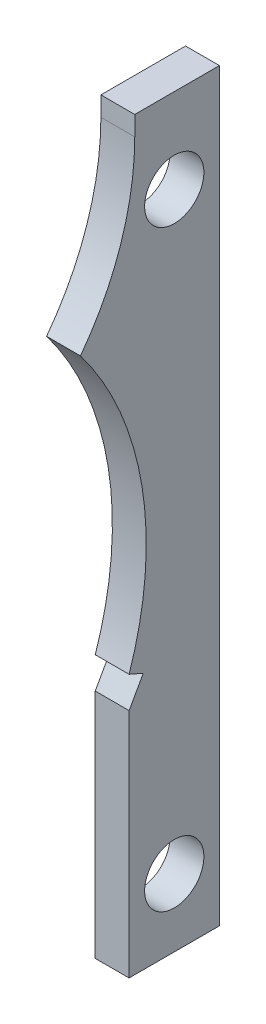
ISO-10303-21;
HEADER;
FILE_DESCRIPTION(('STEP AP214'),'2;1');
FILE_NAME('part.step','',(''),(''),'','','');
FILE_SCHEMA(('AUTOMOTIVE_DESIGN { 1 0 10303 214 1 1 1 1 }'));
ENDSEC;
DATA;
#1=APPLICATION_CONTEXT('core data for automotive mechanical design processes');
#2=APPLICATION_PROTOCOL_DEFINITION('international standard','automotive_design',2000,#1);
#3=PRODUCT_CONTEXT('',#1,'mechanical');
#4=PRODUCT('Part','Part','',(#3));
#5=PRODUCT_RELATED_PRODUCT_CATEGORY('part','',(#4));
#6=PRODUCT_DEFINITION_FORMATION('','',#4);
#7=PRODUCT_DEFINITION_CONTEXT('part definition',#1,'design');
#8=PRODUCT_DEFINITION('design','',#6,#7);
#9=PRODUCT_DEFINITION_SHAPE('','',#8);
#10=(LENGTH_UNIT() NAMED_UNIT(*) SI_UNIT(.MILLI.,.METRE.));
#11=(NAMED_UNIT(*) PLANE_ANGLE_UNIT() SI_UNIT($,.RADIAN.));
#12=(NAMED_UNIT(*) SI_UNIT($,.STERADIAN.) SOLID_ANGLE_UNIT());
#13=UNCERTAINTY_MEASURE_WITH_UNIT(LENGTH_MEASURE(1.E-05),#10,'distance_accuracy_value','');
#14=(GEOMETRIC_REPRESENTATION_CONTEXT(3) GLOBAL_UNCERTAINTY_ASSIGNED_CONTEXT((#13)) GLOBAL_UNIT_ASSIGNED_CONTEXT((#10,
#11,#12)) REPRESENTATION_CONTEXT('',''));
#15=CARTESIAN_POINT('',(0.,0.,0.));
#16=DIRECTION('',(0.,0.,1.));
#17=DIRECTION('',(1.,0.,0.));
#18=AXIS2_PLACEMENT_3D('',#15,#16,#17);
#19=CARTESIAN_POINT('',(3.,66.,0.));
#20=DIRECTION('',(0.,0.,1.));
#21=DIRECTION('',(0.,-1.,0.));
#22=AXIS2_PLACEMENT_3D('',#19,#20,#21);
#23=PLANE('',#22);
#24=DIRECTION('',(0.,1.,0.));
#25=VECTOR('',#24,1.);
#26=CARTESIAN_POINT('',(-3.,66.,0.));
#27=LINE('',#26,#25);
#28=CARTESIAN_POINT('',(-3.,-66.,0.));
#29=VERTEX_POINT('',#28);
#30=CARTESIAN_POINT('',(-3.,66.,0.));
#31=VERTEX_POINT('',#30);
#32=EDGE_CURVE('E134',#29,#31,#27,.T.);
#33=ORIENTED_EDGE('',*,*,#32,.T.);
#34=DIRECTION('',(-1.,0.,0.));
#35=VECTOR('',#34,1.);
#36=CARTESIAN_POINT('',(3.,66.,0.));
#37=LINE('',#36,#35);
#38=CARTESIAN_POINT('',(3.,66.,0.));
#39=VERTEX_POINT('',#38);
#40=EDGE_CURVE('E11',#39,#31,#37,.T.);
#41=ORIENTED_EDGE('',*,*,#40,.F.);
#42=DIRECTION('',(0.,1.,0.));
#43=VECTOR('',#42,1.);
#44=CARTESIAN_POINT('',(3.,66.,0.));
#45=LINE('',#44,#43);
#46=CARTESIAN_POINT('',(3.,-66.,0.));
#47=VERTEX_POINT('',#46);
#48=EDGE_CURVE('E151',#47,#39,#45,.T.);
#49=ORIENTED_EDGE('',*,*,#48,.F.);
#50=DIRECTION('',(-1.,0.,0.));
#51=VECTOR('',#50,1.);
#52=CARTESIAN_POINT('',(3.,-66.,0.));
#53=LINE('',#52,#51);
#54=EDGE_CURVE('E130',#47,#29,#53,.T.);
#55=ORIENTED_EDGE('',*,*,#54,.T.);
#56=EDGE_LOOP('',(#33,#41,#49,#55));
#57=FACE_BOUND('',#56,.T.);
#58=ADVANCED_FACE('F32',(#57),#23,.F.);
#59=CARTESIAN_POINT('',(3.,66.,0.));
#60=DIRECTION('',(0.,-1.,0.));
#61=DIRECTION('',(0.,0.,-1.));
#62=AXIS2_PLACEMENT_3D('',#59,#60,#61);
#63=PLANE('',#62);
#64=DIRECTION('',(0.,0.,1.));
#65=VECTOR('',#64,1.);
#66=CARTESIAN_POINT('',(-3.,66.,0.));
#67=LINE('',#66,#65);
#68=CARTESIAN_POINT('',(-3.,66.,15.));
#69=VERTEX_POINT('',#68);
#70=EDGE_CURVE('E137',#31,#69,#67,.T.);
#71=ORIENTED_EDGE('',*,*,#70,.T.);
#72=DIRECTION('',(-1.,0.,0.));
#73=VECTOR('',#72,1.);
#74=CARTESIAN_POINT('',(3.,66.,15.));
#75=LINE('',#74,#73);
#76=CARTESIAN_POINT('',(3.,66.,15.));
#77=VERTEX_POINT('',#76);
#78=EDGE_CURVE('E40',#77,#69,#75,.T.);
#79=ORIENTED_EDGE('',*,*,#78,.F.);
#80=DIRECTION('',(0.,0.,1.));
#81=VECTOR('',#80,1.);
#82=CARTESIAN_POINT('',(3.,66.,0.));
#83=LINE('',#82,#81);
#84=EDGE_CURVE('E94',#39,#77,#83,.T.);
#85=ORIENTED_EDGE('',*,*,#84,.F.);
#86=ORIENTED_EDGE('',*,*,#40,.T.);
#87=EDGE_LOOP('',(#71,#79,#85,#86));
#88=FACE_BOUND('',#87,.T.);
#89=ADVANCED_FACE('F229',(#88),#63,.F.);
#90=CARTESIAN_POINT('',(3.,66.,15.));
#91=DIRECTION('',(0.,0.,-1.));
#92=DIRECTION('',(0.,1.,0.));
#93=AXIS2_PLACEMENT_3D('',#90,#91,#92);
#94=PLANE('',#93);
#95=DIRECTION('',(0.,-1.,0.));
#96=VECTOR('',#95,1.);
#97=CARTESIAN_POINT('',(-3.,66.,15.));
#98=LINE('',#97,#96);
#99=CARTESIAN_POINT('',(-3.,62.56,15.));
#100=VERTEX_POINT('',#99);
#101=EDGE_CURVE('E140',#69,#100,#98,.T.);
#102=ORIENTED_EDGE('',*,*,#101,.T.);
#103=DIRECTION('',(-1.,0.,0.));
#104=VECTOR('',#103,1.);
#105=CARTESIAN_POINT('',(3.,62.56,15.));
#106=LINE('',#105,#104);
#107=CARTESIAN_POINT('',(3.,62.56,15.));
#108=VERTEX_POINT('',#107);
#109=EDGE_CURVE('E161',#108,#100,#106,.T.);
#110=ORIENTED_EDGE('',*,*,#109,.F.);
#111=DIRECTION('',(0.,-1.,0.));
#112=VECTOR('',#111,1.);
#113=CARTESIAN_POINT('',(3.,66.,15.));
#114=LINE('',#113,#112);
#115=EDGE_CURVE('E169',#77,#108,#114,.T.);
#116=ORIENTED_EDGE('',*,*,#115,.F.);
#117=ORIENTED_EDGE('',*,*,#78,.T.);
#118=EDGE_LOOP('',(#102,#110,#116,#117));
#119=FACE_BOUND('',#118,.T.);
#120=ADVANCED_FACE('F167',(#119),#94,.F.);
#121=CARTESIAN_POINT('',(3.,62.56,62.9));
#122=DIRECTION('',(-1.,0.,0.));
#123=DIRECTION('',(0.,0.,1.));
#124=AXIS2_PLACEMENT_3D('',#121,#122,#123);
#125=CYLINDRICAL_SURFACE('',#124,47.9);
#126=CARTESIAN_POINT('',(-3.,62.56,62.9));
#127=DIRECTION('',(-1.,0.,0.));
#128=DIRECTION('',(0.,0.,-1.));
#129=AXIS2_PLACEMENT_3D('',#126,#127,#128);
#130=CIRCLE('',#129,47.9);
#131=CARTESIAN_POINT('',(-3.,33.7654535309983,24.6209705759863));
#132=VERTEX_POINT('',#131);
#133=EDGE_CURVE('E142',#100,#132,#130,.T.);
#134=ORIENTED_EDGE('',*,*,#133,.T.);
#135=DIRECTION('',(-1.,0.,0.));
#136=VECTOR('',#135,1.);
#137=CARTESIAN_POINT('',(3.,33.7654535309983,24.6209705759863));
#138=LINE('',#137,#136);
#139=CARTESIAN_POINT('',(3.,33.7654535309983,24.6209705759863));
#140=VERTEX_POINT('',#139);
#141=EDGE_CURVE('E158',#140,#132,#138,.T.);
#142=ORIENTED_EDGE('',*,*,#141,.F.);
#143=CARTESIAN_POINT('',(3.,62.56,62.9));
#144=DIRECTION('',(-1.,0.,0.));
#145=DIRECTION('',(0.,0.,-1.));
#146=AXIS2_PLACEMENT_3D('',#143,#144,#145);
#147=CIRCLE('',#146,47.9);
#148=EDGE_CURVE('E185',#108,#140,#147,.T.);
#149=ORIENTED_EDGE('',*,*,#148,.F.);
#150=ORIENTED_EDGE('',*,*,#109,.T.);
#151=EDGE_LOOP('',(#134,#142,#149,#150));
#152=FACE_BOUND('',#151,.T.);
#153=ADVANCED_FACE('F178',(#152),#125,.F.);
#154=CARTESIAN_POINT('',(3.,-0.959999999999997,70.52));
#155=DIRECTION('',(-1.,0.,0.));
#156=DIRECTION('',(0.,0.,1.));
#157=AXIS2_PLACEMENT_3D('',#154,#155,#156);
#158=CYLINDRICAL_SURFACE('',#157,57.555);
#159=CARTESIAN_POINT('',(-3.,-0.959999999999997,70.52));
#160=DIRECTION('',(-1.,0.,0.));
#161=DIRECTION('',(0.,0.,-1.));
#162=AXIS2_PLACEMENT_3D('',#159,#160,#161);
#163=CIRCLE('',#162,57.555);
#164=CARTESIAN_POINT('',(-3.,-19.4030915250129,16.));
#165=VERTEX_POINT('',#164);
#166=EDGE_CURVE('E144',#132,#165,#163,.T.);
#167=ORIENTED_EDGE('',*,*,#166,.T.);
#168=DIRECTION('',(-1.,0.,0.));
#169=VECTOR('',#168,1.);
#170=CARTESIAN_POINT('',(3.,-19.4030915250129,16.));
#171=LINE('',#170,#169);
#172=CARTESIAN_POINT('',(3.,-19.4030915250129,16.));
#173=VERTEX_POINT('',#172);
#174=EDGE_CURVE('E155',#173,#165,#171,.T.);
#175=ORIENTED_EDGE('',*,*,#174,.F.);
#176=CARTESIAN_POINT('',(3.,-0.959999999999997,70.52));
#177=DIRECTION('',(-1.,0.,0.));
#178=DIRECTION('',(0.,0.,-1.));
#179=AXIS2_PLACEMENT_3D('',#176,#177,#178);
#180=CIRCLE('',#179,57.555);
#181=EDGE_CURVE('E184',#140,#173,#180,.T.);
#182=ORIENTED_EDGE('',*,*,#181,.F.);
#183=ORIENTED_EDGE('',*,*,#141,.T.);
#184=EDGE_LOOP('',(#167,#175,#182,#183));
#185=FACE_BOUND('',#184,.T.);
#186=ADVANCED_FACE('F182',(#185),#158,.F.);
#187=CARTESIAN_POINT('',(3.,-19.4030915250129,16.));
#188=DIRECTION('',(0.,0.915494413653172,-0.402330683107607));
#189=DIRECTION('',(0.,0.402330683107607,0.915494413653173));
#190=AXIS2_PLACEMENT_3D('',#187,#188,#189);
#191=PLANE('',#190);
#192=DIRECTION('',(0.,-0.402330683107607,-0.915494413653173));
#193=VECTOR('',#192,1.);
#194=CARTESIAN_POINT('',(-3.,-19.4030915250129,16.));
#195=LINE('',#194,#193);
#196=CARTESIAN_POINT('',(-3.,-20.5014542898966,13.5007002507268));
#197=VERTEX_POINT('',#196);
#198=EDGE_CURVE('E146',#165,#197,#195,.T.);
#199=ORIENTED_EDGE('',*,*,#198,.T.);
#200=DIRECTION('',(-1.,0.,0.));
#201=VECTOR('',#200,1.);
#202=CARTESIAN_POINT('',(3.,-20.5014542898966,13.5007002507268));
#203=LINE('',#202,#201);
#204=CARTESIAN_POINT('',(3.,-20.5014542898966,13.5007002507268));
#205=VERTEX_POINT('',#204);
#206=EDGE_CURVE('E125',#205,#197,#203,.T.);
#207=ORIENTED_EDGE('',*,*,#206,.F.);
#208=DIRECTION('',(0.,-0.402330683107607,-0.915494413653173));
#209=VECTOR('',#208,1.);
#210=CARTESIAN_POINT('',(3.,-19.4030915250129,16.));
#211=LINE('',#210,#209);
#212=EDGE_CURVE('E116',#173,#205,#211,.T.);
#213=ORIENTED_EDGE('',*,*,#212,.F.);
#214=ORIENTED_EDGE('',*,*,#174,.T.);
#215=EDGE_LOOP('',(#199,#207,#213,#214));
#216=FACE_BOUND('',#215,.T.);
#217=ADVANCED_FACE('F237',(#216),#191,.F.);
#218=CARTESIAN_POINT('',(3.,-20.5014542898966,13.5007002507268));
#219=DIRECTION('',(0.,-0.488144482279914,-0.872762834004562));
#220=DIRECTION('',(0.,0.872762834004562,-0.488144482279914));
#221=AXIS2_PLACEMENT_3D('',#218,#219,#220);
#222=PLANE('',#221);
#223=DIRECTION('',(0.,-0.872762834004562,0.488144482279914));
#224=VECTOR('',#223,1.);
#225=CARTESIAN_POINT('',(-3.,-20.5014542898966,13.5007002507268));
#226=LINE('',#225,#224);
#227=CARTESIAN_POINT('',(-3.,-24.97,16.));
#228=VERTEX_POINT('',#227);
#229=EDGE_CURVE('E124',#197,#228,#226,.T.);
#230=ORIENTED_EDGE('',*,*,#229,.T.);
#231=DIRECTION('',(-1.,0.,0.));
#232=VECTOR('',#231,1.);
#233=CARTESIAN_POINT('',(3.,-24.97,16.));
#234=LINE('',#233,#232);
#235=CARTESIAN_POINT('',(3.,-24.97,16.));
#236=VERTEX_POINT('',#235);
#237=EDGE_CURVE('E121',#236,#228,#234,.T.);
#238=ORIENTED_EDGE('',*,*,#237,.F.);
#239=DIRECTION('',(0.,-0.872762834004562,0.488144482279914));
#240=VECTOR('',#239,1.);
#241=CARTESIAN_POINT('',(3.,-20.5014542898966,13.5007002507268));
#242=LINE('',#241,#240);
#243=EDGE_CURVE('E110',#205,#236,#242,.T.);
#244=ORIENTED_EDGE('',*,*,#243,.F.);
#245=ORIENTED_EDGE('',*,*,#206,.T.);
#246=EDGE_LOOP('',(#230,#238,#244,#245));
#247=FACE_BOUND('',#246,.T.);
#248=ADVANCED_FACE('F122',(#247),#222,.F.);
#249=CARTESIAN_POINT('',(3.,-24.97,16.));
#250=DIRECTION('',(0.,0.,-1.));
#251=DIRECTION('',(0.,1.,0.));
#252=AXIS2_PLACEMENT_3D('',#249,#250,#251);
#253=PLANE('',#252);
#254=DIRECTION('',(0.,-1.,0.));
#255=VECTOR('',#254,1.);
#256=CARTESIAN_POINT('',(-3.,-24.97,16.));
#257=LINE('',#256,#255);
#258=CARTESIAN_POINT('',(-3.,-66.,16.));
#259=VERTEX_POINT('',#258);
#260=EDGE_CURVE('E80',#228,#259,#257,.T.);
#261=ORIENTED_EDGE('',*,*,#260,.T.);
#262=DIRECTION('',(-1.,0.,0.));
#263=VECTOR('',#262,1.);
#264=CARTESIAN_POINT('',(3.,-66.,16.));
#265=LINE('',#264,#263);
#266=CARTESIAN_POINT('',(3.,-66.,16.));
#267=VERTEX_POINT('',#266);
#268=EDGE_CURVE('E126',#267,#259,#265,.T.);
#269=ORIENTED_EDGE('',*,*,#268,.F.);
#270=DIRECTION('',(0.,-1.,0.));
#271=VECTOR('',#270,1.);
#272=CARTESIAN_POINT('',(3.,-24.97,16.));
#273=LINE('',#272,#271);
#274=EDGE_CURVE('E114',#236,#267,#273,.T.);
#275=ORIENTED_EDGE('',*,*,#274,.F.);
#276=ORIENTED_EDGE('',*,*,#237,.T.);
#277=EDGE_LOOP('',(#261,#269,#275,#276));
#278=FACE_BOUND('',#277,.T.);
#279=ADVANCED_FACE('F128',(#278),#253,.F.);
#280=CARTESIAN_POINT('',(3.,-66.,0.));
#281=DIRECTION('',(0.,1.,0.));
#282=DIRECTION('',(0.,0.,1.));
#283=AXIS2_PLACEMENT_3D('',#280,#281,#282);
#284=PLANE('',#283);
#285=DIRECTION('',(0.,0.,-1.));
#286=VECTOR('',#285,1.);
#287=CARTESIAN_POINT('',(-3.,-66.,0.));
#288=LINE('',#287,#286);
#289=EDGE_CURVE('E86',#259,#29,#288,.T.);
#290=ORIENTED_EDGE('',*,*,#289,.T.);
#291=ORIENTED_EDGE('',*,*,#54,.F.);
#292=DIRECTION('',(0.,0.,-1.));
#293=VECTOR('',#292,1.);
#294=CARTESIAN_POINT('',(3.,-66.,0.));
#295=LINE('',#294,#293);
#296=EDGE_CURVE('E48',#267,#47,#295,.T.);
#297=ORIENTED_EDGE('',*,*,#296,.F.);
#298=ORIENTED_EDGE('',*,*,#268,.T.);
#299=EDGE_LOOP('',(#290,#291,#297,#298));
#300=FACE_BOUND('',#299,.T.);
#301=ADVANCED_FACE('F215',(#300),#284,.F.);
#302=CARTESIAN_POINT('',(3.,-0.959999999999997,70.52));
#303=DIRECTION('',(1.,0.,0.));
#304=DIRECTION('',(0.,0.,-1.));
#305=AXIS2_PLACEMENT_3D('',#302,#303,#304);
#306=PLANE('',#305);
#307=CARTESIAN_POINT('',(3.,51.,8.));
#308=DIRECTION('',(1.,0.,0.));
#309=DIRECTION('',(0.,0.,-1.));
#310=AXIS2_PLACEMENT_3D('',#307,#308,#309);
#311=CIRCLE('',#310,5.25);
#312=CARTESIAN_POINT('',(3.,51.,2.75));
#313=VERTEX_POINT('',#312);
#314=EDGE_CURVE('E198',#313,#313,#311,.T.);
#315=ORIENTED_EDGE('',*,*,#314,.F.);
#316=EDGE_LOOP('',(#315));
#317=FACE_BOUND('',#316,.T.);
#318=CARTESIAN_POINT('',(3.,-54.,8.));
#319=DIRECTION('',(1.,0.,0.));
#320=DIRECTION('',(0.,0.,-1.));
#321=AXIS2_PLACEMENT_3D('',#318,#319,#320);
#322=CIRCLE('',#321,5.25);
#323=CARTESIAN_POINT('',(3.,-54.,2.75));
#324=VERTEX_POINT('',#323);
#325=EDGE_CURVE('E192',#324,#324,#322,.T.);
#326=ORIENTED_EDGE('',*,*,#325,.F.);
#327=EDGE_LOOP('',(#326));
#328=FACE_BOUND('',#327,.T.);
#329=ORIENTED_EDGE('',*,*,#48,.T.);
#330=ORIENTED_EDGE('',*,*,#84,.T.);
#331=ORIENTED_EDGE('',*,*,#115,.T.);
#332=ORIENTED_EDGE('',*,*,#148,.T.);
#333=ORIENTED_EDGE('',*,*,#181,.T.);
#334=ORIENTED_EDGE('',*,*,#212,.T.);
#335=ORIENTED_EDGE('',*,*,#243,.T.);
#336=ORIENTED_EDGE('',*,*,#274,.T.);
#337=ORIENTED_EDGE('',*,*,#296,.T.);
#338=EDGE_LOOP('',(#329,#330,#331,#332,#333,#334,#335,#336,#337));
#339=FACE_BOUND('',#338,.T.);
#340=ADVANCED_FACE('F112',(#317,#328,#339),#306,.T.);
#341=CARTESIAN_POINT('',(-3.,-0.959999999999997,70.52));
#342=DIRECTION('',(1.,0.,0.));
#343=DIRECTION('',(0.,0.,-1.));
#344=AXIS2_PLACEMENT_3D('',#341,#342,#343);
#345=PLANE('',#344);
#346=CARTESIAN_POINT('',(-3.,51.,8.));
#347=DIRECTION('',(1.,0.,0.));
#348=DIRECTION('',(0.,0.,-1.));
#349=AXIS2_PLACEMENT_3D('',#346,#347,#348);
#350=CIRCLE('',#349,5.25);
#351=CARTESIAN_POINT('',(-3.,51.,2.75));
#352=VERTEX_POINT('',#351);
#353=EDGE_CURVE('E138',#352,#352,#350,.T.);
#354=ORIENTED_EDGE('',*,*,#353,.T.);
#355=EDGE_LOOP('',(#354));
#356=FACE_BOUND('',#355,.T.);
#357=CARTESIAN_POINT('',(-3.,-54.,8.));
#358=DIRECTION('',(1.,0.,0.));
#359=DIRECTION('',(0.,0.,-1.));
#360=AXIS2_PLACEMENT_3D('',#357,#358,#359);
#361=CIRCLE('',#360,5.25);
#362=CARTESIAN_POINT('',(-3.,-54.,2.75));
#363=VERTEX_POINT('',#362);
#364=EDGE_CURVE('E195',#363,#363,#361,.T.);
#365=ORIENTED_EDGE('',*,*,#364,.T.);
#366=EDGE_LOOP('',(#365));
#367=FACE_BOUND('',#366,.T.);
#368=ORIENTED_EDGE('',*,*,#32,.F.);
#369=ORIENTED_EDGE('',*,*,#289,.F.);
#370=ORIENTED_EDGE('',*,*,#260,.F.);
#371=ORIENTED_EDGE('',*,*,#229,.F.);
#372=ORIENTED_EDGE('',*,*,#198,.F.);
#373=ORIENTED_EDGE('',*,*,#166,.F.);
#374=ORIENTED_EDGE('',*,*,#133,.F.);
#375=ORIENTED_EDGE('',*,*,#101,.F.);
#376=ORIENTED_EDGE('',*,*,#70,.F.);
#377=EDGE_LOOP('',(#368,#369,#370,#371,#372,#373,#374,#375,#376));
#378=FACE_BOUND('',#377,.T.);
#379=ADVANCED_FACE('F173',(#356,#367,#378),#345,.F.);
#380=CARTESIAN_POINT('',(-3.,-54.,8.));
#381=DIRECTION('',(1.,0.,0.));
#382=DIRECTION('',(0.,0.,-1.));
#383=AXIS2_PLACEMENT_3D('',#380,#381,#382);
#384=CYLINDRICAL_SURFACE('',#383,5.25);
#385=ORIENTED_EDGE('',*,*,#364,.F.);
#386=EDGE_LOOP('',(#385));
#387=FACE_BOUND('',#386,.T.);
#388=ORIENTED_EDGE('',*,*,#325,.T.);
#389=EDGE_LOOP('',(#388));
#390=FACE_BOUND('',#389,.T.);
#391=ADVANCED_FACE('F209',(#387,#390),#384,.F.);
#392=CARTESIAN_POINT('',(-3.,51.,8.));
#393=DIRECTION('',(1.,0.,0.));
#394=DIRECTION('',(0.,0.,-1.));
#395=AXIS2_PLACEMENT_3D('',#392,#393,#394);
#396=CYLINDRICAL_SURFACE('',#395,5.25);
#397=ORIENTED_EDGE('',*,*,#353,.F.);
#398=EDGE_LOOP('',(#397));
#399=FACE_BOUND('',#398,.T.);
#400=ORIENTED_EDGE('',*,*,#314,.T.);
#401=EDGE_LOOP('',(#400));
#402=FACE_BOUND('',#401,.T.);
#403=ADVANCED_FACE('F206',(#399,#402),#396,.F.);
#404=CLOSED_SHELL('',(#58,#89,#120,#153,#186,#217,#248,#279,#301,#340,#379,#391,#403));
#405=MANIFOLD_SOLID_BREP('B2',#404);
#406=ADVANCED_BREP_SHAPE_REPRESENTATION('',(#18,#405),#14);
#407=SHAPE_DEFINITION_REPRESENTATION(#9,#406);
ENDSEC;
END-ISO-10303-21;
